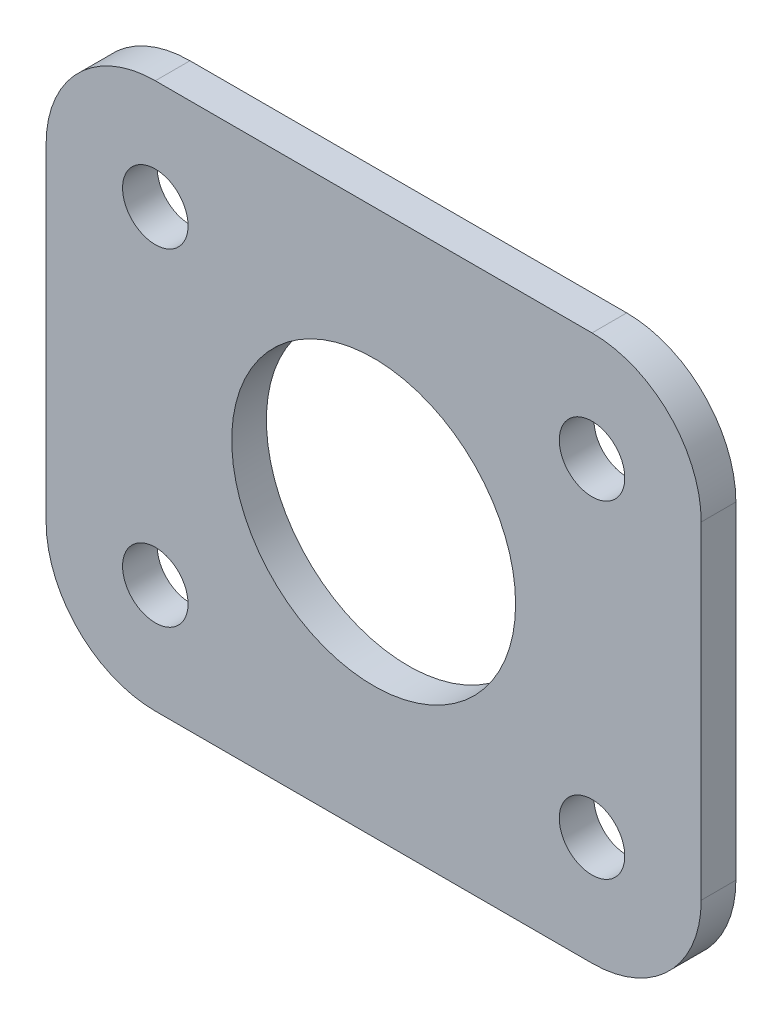
ISO-10303-21;
HEADER;
FILE_DESCRIPTION(('STEP AP214'),'2;1');
FILE_NAME('part.step','',(''),(''),'','','');
FILE_SCHEMA(('AUTOMOTIVE_DESIGN { 1 0 10303 214 1 1 1 1 }'));
ENDSEC;
DATA;
#1=APPLICATION_CONTEXT('core data for automotive mechanical design processes');
#2=APPLICATION_PROTOCOL_DEFINITION('international standard','automotive_design',2000,#1);
#3=PRODUCT_CONTEXT('',#1,'mechanical');
#4=PRODUCT('Part','Part','',(#3));
#5=PRODUCT_RELATED_PRODUCT_CATEGORY('part','',(#4));
#6=PRODUCT_DEFINITION_FORMATION('','',#4);
#7=PRODUCT_DEFINITION_CONTEXT('part definition',#1,'design');
#8=PRODUCT_DEFINITION('design','',#6,#7);
#9=PRODUCT_DEFINITION_SHAPE('','',#8);
#10=(LENGTH_UNIT() NAMED_UNIT(*) SI_UNIT(.MILLI.,.METRE.));
#11=(NAMED_UNIT(*) PLANE_ANGLE_UNIT() SI_UNIT($,.RADIAN.));
#12=(NAMED_UNIT(*) SI_UNIT($,.STERADIAN.) SOLID_ANGLE_UNIT());
#13=UNCERTAINTY_MEASURE_WITH_UNIT(LENGTH_MEASURE(1.E-05),#10,'distance_accuracy_value','');
#14=(GEOMETRIC_REPRESENTATION_CONTEXT(3) GLOBAL_UNCERTAINTY_ASSIGNED_CONTEXT((#13)) GLOBAL_UNIT_ASSIGNED_CONTEXT((#10,
#11,#12)) REPRESENTATION_CONTEXT('',''));
#15=CARTESIAN_POINT('',(0.,0.,0.));
#16=DIRECTION('',(0.,0.,1.));
#17=DIRECTION('',(1.,0.,0.));
#18=AXIS2_PLACEMENT_3D('',#15,#16,#17);
#19=CARTESIAN_POINT('',(0.,0.,1.5875));
#20=DIRECTION('',(0.,0.,-1.));
#21=DIRECTION('',(-1.,0.,0.));
#22=AXIS2_PLACEMENT_3D('',#19,#20,#21);
#23=PLANE('',#22);
#24=DIRECTION('',(1.,0.,0.));
#25=VECTOR('',#24,1.);
#26=CARTESIAN_POINT('',(0.,0.,1.5875));
#27=LINE('',#26,#25);
#28=CARTESIAN_POINT('',(5.,0.,1.5875));
#29=VERTEX_POINT('',#28);
#30=CARTESIAN_POINT('',(25.,0.,1.5875));
#31=VERTEX_POINT('',#30);
#32=EDGE_CURVE('E140',#29,#31,#27,.T.);
#33=ORIENTED_EDGE('',*,*,#32,.T.);
#34=CARTESIAN_POINT('',(25.,5.00000000000001,1.5875));
#35=DIRECTION('',(0.,0.,-1.));
#36=DIRECTION('',(-1.,0.,0.));
#37=AXIS2_PLACEMENT_3D('',#34,#35,#36);
#38=CIRCLE('',#37,5.);
#39=CARTESIAN_POINT('',(30.,5.00000000000002,1.5875));
#40=VERTEX_POINT('',#39);
#41=EDGE_CURVE('E155',#31,#40,#38,.F.);
#42=ORIENTED_EDGE('',*,*,#41,.T.);
#43=DIRECTION('',(0.,1.,0.));
#44=VECTOR('',#43,1.);
#45=CARTESIAN_POINT('',(30.,25.,1.5875));
#46=LINE('',#45,#44);
#47=CARTESIAN_POINT('',(30.,20.,1.5875));
#48=VERTEX_POINT('',#47);
#49=EDGE_CURVE('E122',#40,#48,#46,.T.);
#50=ORIENTED_EDGE('',*,*,#49,.T.);
#51=CARTESIAN_POINT('',(25.,20.,1.5875));
#52=DIRECTION('',(0.,0.,-1.));
#53=DIRECTION('',(-1.,0.,0.));
#54=AXIS2_PLACEMENT_3D('',#51,#52,#53);
#55=CIRCLE('',#54,5.);
#56=CARTESIAN_POINT('',(25.,25.,1.5875));
#57=VERTEX_POINT('',#56);
#58=EDGE_CURVE('E153',#48,#57,#55,.F.);
#59=ORIENTED_EDGE('',*,*,#58,.T.);
#60=DIRECTION('',(-1.,0.,0.));
#61=VECTOR('',#60,1.);
#62=CARTESIAN_POINT('',(0.,25.,1.5875));
#63=LINE('',#62,#61);
#64=CARTESIAN_POINT('',(5.,25.,1.5875));
#65=VERTEX_POINT('',#64);
#66=EDGE_CURVE('E175',#57,#65,#63,.T.);
#67=ORIENTED_EDGE('',*,*,#66,.T.);
#68=CARTESIAN_POINT('',(5.,20.,1.5875));
#69=DIRECTION('',(0.,0.,-1.));
#70=DIRECTION('',(-1.,0.,0.));
#71=AXIS2_PLACEMENT_3D('',#68,#69,#70);
#72=CIRCLE('',#71,5.);
#73=CARTESIAN_POINT('',(0.,20.,1.5875));
#74=VERTEX_POINT('',#73);
#75=EDGE_CURVE('E57',#65,#74,#72,.F.);
#76=ORIENTED_EDGE('',*,*,#75,.T.);
#77=DIRECTION('',(0.,-1.,0.));
#78=VECTOR('',#77,1.);
#79=CARTESIAN_POINT('',(0.,0.,1.5875));
#80=LINE('',#79,#78);
#81=CARTESIAN_POINT('',(0.,5.,1.5875));
#82=VERTEX_POINT('',#81);
#83=EDGE_CURVE('E141',#74,#82,#80,.T.);
#84=ORIENTED_EDGE('',*,*,#83,.T.);
#85=CARTESIAN_POINT('',(5.,5.,1.5875));
#86=DIRECTION('',(0.,0.,-1.));
#87=DIRECTION('',(-1.,0.,0.));
#88=AXIS2_PLACEMENT_3D('',#85,#86,#87);
#89=CIRCLE('',#88,5.);
#90=EDGE_CURVE('E151',#82,#29,#89,.F.);
#91=ORIENTED_EDGE('',*,*,#90,.T.);
#92=EDGE_LOOP('',(#33,#42,#50,#59,#67,#76,#84,#91));
#93=FACE_BOUND('',#92,.T.);
#94=CARTESIAN_POINT('',(15.,12.5,1.5875));
#95=DIRECTION('',(0.,0.,1.));
#96=DIRECTION('',(1.,0.,0.));
#97=AXIS2_PLACEMENT_3D('',#94,#95,#96);
#98=CIRCLE('',#97,6.5);
#99=CARTESIAN_POINT('',(21.5,12.5,1.5875));
#100=VERTEX_POINT('',#99);
#101=EDGE_CURVE('E135',#100,#100,#98,.T.);
#102=ORIENTED_EDGE('',*,*,#101,.F.);
#103=EDGE_LOOP('',(#102));
#104=FACE_BOUND('',#103,.T.);
#105=CARTESIAN_POINT('',(5.,20.,1.5875));
#106=DIRECTION('',(0.,0.,1.));
#107=DIRECTION('',(1.,0.,0.));
#108=AXIS2_PLACEMENT_3D('',#105,#106,#107);
#109=CIRCLE('',#108,1.5);
#110=CARTESIAN_POINT('',(6.5,20.,1.5875));
#111=VERTEX_POINT('',#110);
#112=EDGE_CURVE('E190',#111,#111,#109,.T.);
#113=ORIENTED_EDGE('',*,*,#112,.F.);
#114=EDGE_LOOP('',(#113));
#115=FACE_BOUND('',#114,.T.);
#116=CARTESIAN_POINT('',(5.00000000000001,5.,1.5875));
#117=DIRECTION('',(0.,0.,1.));
#118=DIRECTION('',(1.,0.,0.));
#119=AXIS2_PLACEMENT_3D('',#116,#117,#118);
#120=CIRCLE('',#119,1.5);
#121=CARTESIAN_POINT('',(6.50000000000001,5.,1.5875));
#122=VERTEX_POINT('',#121);
#123=EDGE_CURVE('E194',#122,#122,#120,.T.);
#124=ORIENTED_EDGE('',*,*,#123,.F.);
#125=EDGE_LOOP('',(#124));
#126=FACE_BOUND('',#125,.T.);
#127=CARTESIAN_POINT('',(25.,5.,1.5875));
#128=DIRECTION('',(0.,0.,1.));
#129=DIRECTION('',(-1.,0.,0.));
#130=AXIS2_PLACEMENT_3D('',#127,#128,#129);
#131=CIRCLE('',#130,1.5);
#132=CARTESIAN_POINT('',(23.5,5.,1.5875));
#133=VERTEX_POINT('',#132);
#134=EDGE_CURVE('E198',#133,#133,#131,.T.);
#135=ORIENTED_EDGE('',*,*,#134,.F.);
#136=EDGE_LOOP('',(#135));
#137=FACE_BOUND('',#136,.T.);
#138=CARTESIAN_POINT('',(25.,20.,1.5875));
#139=DIRECTION('',(0.,0.,1.));
#140=DIRECTION('',(-1.,0.,0.));
#141=AXIS2_PLACEMENT_3D('',#138,#139,#140);
#142=CIRCLE('',#141,1.5);
#143=CARTESIAN_POINT('',(23.5,20.,1.5875));
#144=VERTEX_POINT('',#143);
#145=EDGE_CURVE('E201',#144,#144,#142,.T.);
#146=ORIENTED_EDGE('',*,*,#145,.F.);
#147=EDGE_LOOP('',(#146));
#148=FACE_BOUND('',#147,.T.);
#149=ADVANCED_FACE('F37',(#93,#104,#115,#126,#137,#148),#23,.F.);
#150=CARTESIAN_POINT('',(0.,0.,0.));
#151=DIRECTION('',(0.,0.,-1.));
#152=DIRECTION('',(-1.,0.,0.));
#153=AXIS2_PLACEMENT_3D('',#150,#151,#152);
#154=PLANE('',#153);
#155=CARTESIAN_POINT('',(25.,5.,0.));
#156=DIRECTION('',(0.,0.,1.));
#157=DIRECTION('',(-1.,0.,0.));
#158=AXIS2_PLACEMENT_3D('',#155,#156,#157);
#159=CIRCLE('',#158,1.5);
#160=CARTESIAN_POINT('',(23.5,5.,0.));
#161=VERTEX_POINT('',#160);
#162=EDGE_CURVE('E203',#161,#161,#159,.T.);
#163=ORIENTED_EDGE('',*,*,#162,.T.);
#164=EDGE_LOOP('',(#163));
#165=FACE_BOUND('',#164,.T.);
#166=CARTESIAN_POINT('',(5.,20.,0.));
#167=DIRECTION('',(0.,0.,1.));
#168=DIRECTION('',(1.,0.,0.));
#169=AXIS2_PLACEMENT_3D('',#166,#167,#168);
#170=CIRCLE('',#169,1.5);
#171=CARTESIAN_POINT('',(6.5,20.,0.));
#172=VERTEX_POINT('',#171);
#173=EDGE_CURVE('E214',#172,#172,#170,.T.);
#174=ORIENTED_EDGE('',*,*,#173,.T.);
#175=EDGE_LOOP('',(#174));
#176=FACE_BOUND('',#175,.T.);
#177=DIRECTION('',(0.,1.,0.));
#178=VECTOR('',#177,1.);
#179=CARTESIAN_POINT('',(30.,25.,0.));
#180=LINE('',#179,#178);
#181=CARTESIAN_POINT('',(30.,5.00000000000002,0.));
#182=VERTEX_POINT('',#181);
#183=CARTESIAN_POINT('',(30.,20.,0.));
#184=VERTEX_POINT('',#183);
#185=EDGE_CURVE('E119',#182,#184,#180,.T.);
#186=ORIENTED_EDGE('',*,*,#185,.F.);
#187=CARTESIAN_POINT('',(25.,5.00000000000001,0.));
#188=DIRECTION('',(0.,0.,-1.));
#189=DIRECTION('',(-1.,0.,0.));
#190=AXIS2_PLACEMENT_3D('',#187,#188,#189);
#191=CIRCLE('',#190,5.);
#192=CARTESIAN_POINT('',(25.,0.,0.));
#193=VERTEX_POINT('',#192);
#194=EDGE_CURVE('E102',#182,#193,#191,.T.);
#195=ORIENTED_EDGE('',*,*,#194,.T.);
#196=DIRECTION('',(1.,0.,0.));
#197=VECTOR('',#196,1.);
#198=CARTESIAN_POINT('',(0.,0.,0.));
#199=LINE('',#198,#197);
#200=CARTESIAN_POINT('',(5.,0.,0.));
#201=VERTEX_POINT('',#200);
#202=EDGE_CURVE('E130',#201,#193,#199,.T.);
#203=ORIENTED_EDGE('',*,*,#202,.F.);
#204=CARTESIAN_POINT('',(5.,5.,0.));
#205=DIRECTION('',(0.,0.,-1.));
#206=DIRECTION('',(-1.,0.,0.));
#207=AXIS2_PLACEMENT_3D('',#204,#205,#206);
#208=CIRCLE('',#207,5.);
#209=CARTESIAN_POINT('',(0.,5.,0.));
#210=VERTEX_POINT('',#209);
#211=EDGE_CURVE('E144',#201,#210,#208,.T.);
#212=ORIENTED_EDGE('',*,*,#211,.T.);
#213=DIRECTION('',(0.,-1.,0.));
#214=VECTOR('',#213,1.);
#215=CARTESIAN_POINT('',(0.,0.,0.));
#216=LINE('',#215,#214);
#217=CARTESIAN_POINT('',(0.,20.,0.));
#218=VERTEX_POINT('',#217);
#219=EDGE_CURVE('E133',#218,#210,#216,.T.);
#220=ORIENTED_EDGE('',*,*,#219,.F.);
#221=CARTESIAN_POINT('',(5.,20.,0.));
#222=DIRECTION('',(0.,0.,-1.));
#223=DIRECTION('',(-1.,0.,0.));
#224=AXIS2_PLACEMENT_3D('',#221,#222,#223);
#225=CIRCLE('',#224,5.);
#226=CARTESIAN_POINT('',(5.,25.,0.));
#227=VERTEX_POINT('',#226);
#228=EDGE_CURVE('E123',#218,#227,#225,.T.);
#229=ORIENTED_EDGE('',*,*,#228,.T.);
#230=DIRECTION('',(-1.,0.,0.));
#231=VECTOR('',#230,1.);
#232=CARTESIAN_POINT('',(0.,25.,0.));
#233=LINE('',#232,#231);
#234=CARTESIAN_POINT('',(25.,25.,0.));
#235=VERTEX_POINT('',#234);
#236=EDGE_CURVE('E129',#235,#227,#233,.T.);
#237=ORIENTED_EDGE('',*,*,#236,.F.);
#238=CARTESIAN_POINT('',(25.,20.,0.));
#239=DIRECTION('',(0.,0.,-1.));
#240=DIRECTION('',(-1.,0.,0.));
#241=AXIS2_PLACEMENT_3D('',#238,#239,#240);
#242=CIRCLE('',#241,5.);
#243=EDGE_CURVE('E113',#235,#184,#242,.T.);
#244=ORIENTED_EDGE('',*,*,#243,.T.);
#245=EDGE_LOOP('',(#186,#195,#203,#212,#220,#229,#237,#244));
#246=FACE_BOUND('',#245,.T.);
#247=CARTESIAN_POINT('',(15.,12.5,0.));
#248=DIRECTION('',(0.,0.,1.));
#249=DIRECTION('',(1.,0.,0.));
#250=AXIS2_PLACEMENT_3D('',#247,#248,#249);
#251=CIRCLE('',#250,6.5);
#252=CARTESIAN_POINT('',(21.5,12.5,0.));
#253=VERTEX_POINT('',#252);
#254=EDGE_CURVE('E178',#253,#253,#251,.T.);
#255=ORIENTED_EDGE('',*,*,#254,.T.);
#256=EDGE_LOOP('',(#255));
#257=FACE_BOUND('',#256,.T.);
#258=CARTESIAN_POINT('',(5.00000000000001,5.,0.));
#259=DIRECTION('',(0.,0.,1.));
#260=DIRECTION('',(1.,0.,0.));
#261=AXIS2_PLACEMENT_3D('',#258,#259,#260);
#262=CIRCLE('',#261,1.5);
#263=CARTESIAN_POINT('',(6.50000000000001,5.,0.));
#264=VERTEX_POINT('',#263);
#265=EDGE_CURVE('E211',#264,#264,#262,.T.);
#266=ORIENTED_EDGE('',*,*,#265,.T.);
#267=EDGE_LOOP('',(#266));
#268=FACE_BOUND('',#267,.T.);
#269=CARTESIAN_POINT('',(25.,20.,0.));
#270=DIRECTION('',(0.,0.,1.));
#271=DIRECTION('',(-1.,0.,0.));
#272=AXIS2_PLACEMENT_3D('',#269,#270,#271);
#273=CIRCLE('',#272,1.5);
#274=CARTESIAN_POINT('',(23.5,20.,0.));
#275=VERTEX_POINT('',#274);
#276=EDGE_CURVE('E204',#275,#275,#273,.T.);
#277=ORIENTED_EDGE('',*,*,#276,.T.);
#278=EDGE_LOOP('',(#277));
#279=FACE_BOUND('',#278,.T.);
#280=ADVANCED_FACE('F126',(#165,#176,#246,#257,#268,#279),#154,.T.);
#281=CARTESIAN_POINT('',(0.,0.,1.5875));
#282=DIRECTION('',(0.,1.,0.));
#283=DIRECTION('',(-1.,0.,0.));
#284=AXIS2_PLACEMENT_3D('',#281,#282,#283);
#285=PLANE('',#284);
#286=ORIENTED_EDGE('',*,*,#202,.T.);
#287=DIRECTION('',(0.,0.,-1.));
#288=VECTOR('',#287,1.);
#289=CARTESIAN_POINT('',(25.,0.,1.5875));
#290=LINE('',#289,#288);
#291=EDGE_CURVE('E107',#193,#31,#290,.F.);
#292=ORIENTED_EDGE('',*,*,#291,.T.);
#293=ORIENTED_EDGE('',*,*,#32,.F.);
#294=DIRECTION('',(0.,0.,-1.));
#295=VECTOR('',#294,1.);
#296=CARTESIAN_POINT('',(5.,0.,1.5875));
#297=LINE('',#296,#295);
#298=EDGE_CURVE('E112',#29,#201,#297,.T.);
#299=ORIENTED_EDGE('',*,*,#298,.T.);
#300=EDGE_LOOP('',(#286,#292,#293,#299));
#301=FACE_BOUND('',#300,.T.);
#302=ADVANCED_FACE('F172',(#301),#285,.F.);
#303=CARTESIAN_POINT('',(30.,25.,1.5875));
#304=DIRECTION('',(-1.,0.,0.));
#305=DIRECTION('',(0.,0.,1.));
#306=AXIS2_PLACEMENT_3D('',#303,#304,#305);
#307=PLANE('',#306);
#308=ORIENTED_EDGE('',*,*,#49,.F.);
#309=DIRECTION('',(0.,0.,-1.));
#310=VECTOR('',#309,1.);
#311=CARTESIAN_POINT('',(30.,5.00000000000001,1.5875));
#312=LINE('',#311,#310);
#313=EDGE_CURVE('E106',#40,#182,#312,.T.);
#314=ORIENTED_EDGE('',*,*,#313,.T.);
#315=ORIENTED_EDGE('',*,*,#185,.T.);
#316=DIRECTION('',(0.,0.,-1.));
#317=VECTOR('',#316,1.);
#318=CARTESIAN_POINT('',(30.,20.,1.5875));
#319=LINE('',#318,#317);
#320=EDGE_CURVE('E124',#184,#48,#319,.F.);
#321=ORIENTED_EDGE('',*,*,#320,.T.);
#322=EDGE_LOOP('',(#308,#314,#315,#321));
#323=FACE_BOUND('',#322,.T.);
#324=ADVANCED_FACE('F118',(#323),#307,.F.);
#325=CARTESIAN_POINT('',(0.,25.,1.5875));
#326=DIRECTION('',(0.,-1.,0.));
#327=DIRECTION('',(1.,0.,0.));
#328=AXIS2_PLACEMENT_3D('',#325,#326,#327);
#329=PLANE('',#328);
#330=ORIENTED_EDGE('',*,*,#66,.F.);
#331=DIRECTION('',(0.,0.,-1.));
#332=VECTOR('',#331,1.);
#333=CARTESIAN_POINT('',(25.,25.,1.5875));
#334=LINE('',#333,#332);
#335=EDGE_CURVE('E159',#57,#235,#334,.T.);
#336=ORIENTED_EDGE('',*,*,#335,.T.);
#337=ORIENTED_EDGE('',*,*,#236,.T.);
#338=DIRECTION('',(0.,0.,-1.));
#339=VECTOR('',#338,1.);
#340=CARTESIAN_POINT('',(5.,25.,1.5875));
#341=LINE('',#340,#339);
#342=EDGE_CURVE('E157',#227,#65,#341,.F.);
#343=ORIENTED_EDGE('',*,*,#342,.T.);
#344=EDGE_LOOP('',(#330,#336,#337,#343));
#345=FACE_BOUND('',#344,.T.);
#346=ADVANCED_FACE('F235',(#345),#329,.F.);
#347=CARTESIAN_POINT('',(0.,0.,1.5875));
#348=DIRECTION('',(1.,0.,0.));
#349=DIRECTION('',(0.,0.,-1.));
#350=AXIS2_PLACEMENT_3D('',#347,#348,#349);
#351=PLANE('',#350);
#352=ORIENTED_EDGE('',*,*,#219,.T.);
#353=DIRECTION('',(0.,0.,-1.));
#354=VECTOR('',#353,1.);
#355=CARTESIAN_POINT('',(0.,5.,1.5875));
#356=LINE('',#355,#354);
#357=EDGE_CURVE('E11',#210,#82,#356,.F.);
#358=ORIENTED_EDGE('',*,*,#357,.T.);
#359=ORIENTED_EDGE('',*,*,#83,.F.);
#360=DIRECTION('',(0.,0.,-1.));
#361=VECTOR('',#360,1.);
#362=CARTESIAN_POINT('',(0.,20.,1.5875));
#363=LINE('',#362,#361);
#364=EDGE_CURVE('E45',#74,#218,#363,.T.);
#365=ORIENTED_EDGE('',*,*,#364,.T.);
#366=EDGE_LOOP('',(#352,#358,#359,#365));
#367=FACE_BOUND('',#366,.T.);
#368=ADVANCED_FACE('F164',(#367),#351,.F.);
#369=CARTESIAN_POINT('',(15.,12.5,1.5875));
#370=DIRECTION('',(0.,0.,-1.));
#371=DIRECTION('',(-1.,0.,0.));
#372=AXIS2_PLACEMENT_3D('',#369,#370,#371);
#373=CYLINDRICAL_SURFACE('',#372,6.5);
#374=ORIENTED_EDGE('',*,*,#101,.T.);
#375=EDGE_LOOP('',(#374));
#376=FACE_BOUND('',#375,.T.);
#377=ORIENTED_EDGE('',*,*,#254,.F.);
#378=EDGE_LOOP('',(#377));
#379=FACE_BOUND('',#378,.T.);
#380=ADVANCED_FACE('F224',(#376,#379),#373,.F.);
#381=CARTESIAN_POINT('',(5.,20.,1.5875));
#382=DIRECTION('',(0.,0.,-1.));
#383=DIRECTION('',(-1.,0.,0.));
#384=AXIS2_PLACEMENT_3D('',#381,#382,#383);
#385=CYLINDRICAL_SURFACE('',#384,1.5);
#386=ORIENTED_EDGE('',*,*,#112,.T.);
#387=EDGE_LOOP('',(#386));
#388=FACE_BOUND('',#387,.T.);
#389=ORIENTED_EDGE('',*,*,#173,.F.);
#390=EDGE_LOOP('',(#389));
#391=FACE_BOUND('',#390,.T.);
#392=ADVANCED_FACE('F226',(#388,#391),#385,.F.);
#393=CARTESIAN_POINT('',(5.00000000000001,5.,1.5875));
#394=DIRECTION('',(0.,0.,-1.));
#395=DIRECTION('',(-1.,0.,0.));
#396=AXIS2_PLACEMENT_3D('',#393,#394,#395);
#397=CYLINDRICAL_SURFACE('',#396,1.5);
#398=ORIENTED_EDGE('',*,*,#123,.T.);
#399=EDGE_LOOP('',(#398));
#400=FACE_BOUND('',#399,.T.);
#401=ORIENTED_EDGE('',*,*,#265,.F.);
#402=EDGE_LOOP('',(#401));
#403=FACE_BOUND('',#402,.T.);
#404=ADVANCED_FACE('F232',(#400,#403),#397,.F.);
#405=CARTESIAN_POINT('',(25.,5.,1.5875));
#406=DIRECTION('',(0.,0.,-1.));
#407=DIRECTION('',(-1.,0.,0.));
#408=AXIS2_PLACEMENT_3D('',#405,#406,#407);
#409=CYLINDRICAL_SURFACE('',#408,1.5);
#410=ORIENTED_EDGE('',*,*,#134,.T.);
#411=EDGE_LOOP('',(#410));
#412=FACE_BOUND('',#411,.T.);
#413=ORIENTED_EDGE('',*,*,#162,.F.);
#414=EDGE_LOOP('',(#413));
#415=FACE_BOUND('',#414,.T.);
#416=ADVANCED_FACE('F327',(#412,#415),#409,.F.);
#417=CARTESIAN_POINT('',(25.,20.,1.5875));
#418=DIRECTION('',(0.,0.,-1.));
#419=DIRECTION('',(-1.,0.,0.));
#420=AXIS2_PLACEMENT_3D('',#417,#418,#419);
#421=CYLINDRICAL_SURFACE('',#420,1.5);
#422=ORIENTED_EDGE('',*,*,#145,.T.);
#423=EDGE_LOOP('',(#422));
#424=FACE_BOUND('',#423,.T.);
#425=ORIENTED_EDGE('',*,*,#276,.F.);
#426=EDGE_LOOP('',(#425));
#427=FACE_BOUND('',#426,.T.);
#428=ADVANCED_FACE('F252',(#424,#427),#421,.F.);
#429=CARTESIAN_POINT('',(25.,5.00000000000001,1.5875));
#430=DIRECTION('',(0.,0.,-1.));
#431=DIRECTION('',(-1.,0.,0.));
#432=AXIS2_PLACEMENT_3D('',#429,#430,#431);
#433=CYLINDRICAL_SURFACE('',#432,5.);
#434=ORIENTED_EDGE('',*,*,#41,.F.);
#435=ORIENTED_EDGE('',*,*,#291,.F.);
#436=ORIENTED_EDGE('',*,*,#194,.F.);
#437=ORIENTED_EDGE('',*,*,#313,.F.);
#438=EDGE_LOOP('',(#434,#435,#436,#437));
#439=FACE_BOUND('',#438,.T.);
#440=ADVANCED_FACE('F105',(#439),#433,.T.);
#441=CARTESIAN_POINT('',(25.,20.,1.5875));
#442=DIRECTION('',(0.,0.,-1.));
#443=DIRECTION('',(-1.,0.,0.));
#444=AXIS2_PLACEMENT_3D('',#441,#442,#443);
#445=CYLINDRICAL_SURFACE('',#444,5.);
#446=ORIENTED_EDGE('',*,*,#58,.F.);
#447=ORIENTED_EDGE('',*,*,#320,.F.);
#448=ORIENTED_EDGE('',*,*,#243,.F.);
#449=ORIENTED_EDGE('',*,*,#335,.F.);
#450=EDGE_LOOP('',(#446,#447,#448,#449));
#451=FACE_BOUND('',#450,.T.);
#452=ADVANCED_FACE('F251',(#451),#445,.T.);
#453=CARTESIAN_POINT('',(5.,5.,1.5875));
#454=DIRECTION('',(0.,0.,-1.));
#455=DIRECTION('',(-1.,0.,0.));
#456=AXIS2_PLACEMENT_3D('',#453,#454,#455);
#457=CYLINDRICAL_SURFACE('',#456,5.);
#458=ORIENTED_EDGE('',*,*,#90,.F.);
#459=ORIENTED_EDGE('',*,*,#357,.F.);
#460=ORIENTED_EDGE('',*,*,#211,.F.);
#461=ORIENTED_EDGE('',*,*,#298,.F.);
#462=EDGE_LOOP('',(#458,#459,#460,#461));
#463=FACE_BOUND('',#462,.T.);
#464=ADVANCED_FACE('F169',(#463),#457,.T.);
#465=CARTESIAN_POINT('',(5.,20.,1.5875));
#466=DIRECTION('',(0.,0.,-1.));
#467=DIRECTION('',(-1.,0.,0.));
#468=AXIS2_PLACEMENT_3D('',#465,#466,#467);
#469=CYLINDRICAL_SURFACE('',#468,5.);
#470=ORIENTED_EDGE('',*,*,#75,.F.);
#471=ORIENTED_EDGE('',*,*,#342,.F.);
#472=ORIENTED_EDGE('',*,*,#228,.F.);
#473=ORIENTED_EDGE('',*,*,#364,.F.);
#474=EDGE_LOOP('',(#470,#471,#472,#473));
#475=FACE_BOUND('',#474,.T.);
#476=ADVANCED_FACE('F39',(#475),#469,.T.);
#477=CLOSED_SHELL('',(#149,#280,#302,#324,#346,#368,#380,#392,#404,#416,#428,#440,#452,#464,#476));
#478=MANIFOLD_SOLID_BREP('B2',#477);
#479=ADVANCED_BREP_SHAPE_REPRESENTATION('',(#18,#478),#14);
#480=SHAPE_DEFINITION_REPRESENTATION(#9,#479);
ENDSEC;
END-ISO-10303-21;
